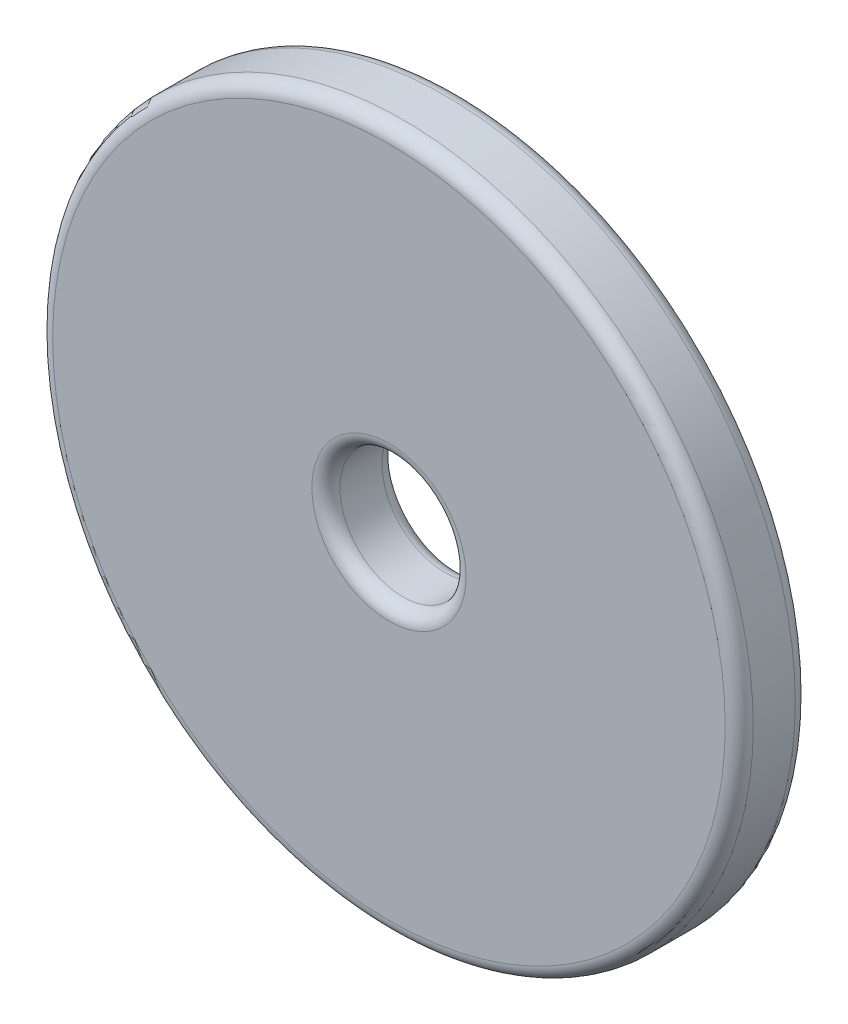
ISO-10303-21;
HEADER;
FILE_DESCRIPTION(('STEP AP214'),'2;1');
FILE_NAME('part.step','',(''),(''),'','','');
FILE_SCHEMA(('AUTOMOTIVE_DESIGN { 1 0 10303 214 1 1 1 1 }'));
ENDSEC;
DATA;
#1=APPLICATION_CONTEXT('core data for automotive mechanical design processes');
#2=APPLICATION_PROTOCOL_DEFINITION('international standard','automotive_design',2000,#1);
#3=PRODUCT_CONTEXT('',#1,'mechanical');
#4=PRODUCT('Part','Part','',(#3));
#5=PRODUCT_RELATED_PRODUCT_CATEGORY('part','',(#4));
#6=PRODUCT_DEFINITION_FORMATION('','',#4);
#7=PRODUCT_DEFINITION_CONTEXT('part definition',#1,'design');
#8=PRODUCT_DEFINITION('design','',#6,#7);
#9=PRODUCT_DEFINITION_SHAPE('','',#8);
#10=(LENGTH_UNIT() NAMED_UNIT(*) SI_UNIT(.MILLI.,.METRE.));
#11=(NAMED_UNIT(*) PLANE_ANGLE_UNIT() SI_UNIT($,.RADIAN.));
#12=(NAMED_UNIT(*) SI_UNIT($,.STERADIAN.) SOLID_ANGLE_UNIT());
#13=UNCERTAINTY_MEASURE_WITH_UNIT(LENGTH_MEASURE(1.E-05),#10,'distance_accuracy_value','');
#14=(GEOMETRIC_REPRESENTATION_CONTEXT(3) GLOBAL_UNCERTAINTY_ASSIGNED_CONTEXT((#13)) GLOBAL_UNIT_ASSIGNED_CONTEXT((#10,
#11,#12)) REPRESENTATION_CONTEXT('',''));
#15=CARTESIAN_POINT('',(0.,0.,0.));
#16=DIRECTION('',(0.,0.,1.));
#17=DIRECTION('',(1.,0.,0.));
#18=AXIS2_PLACEMENT_3D('',#15,#16,#17);
#19=CARTESIAN_POINT('',(0.,0.,0.));
#20=DIRECTION('',(0.,0.,1.));
#21=DIRECTION('',(1.,0.,0.));
#22=AXIS2_PLACEMENT_3D('',#19,#20,#21);
#23=PLANE('',#22);
#24=CARTESIAN_POINT('',(0.,0.,0.));
#25=DIRECTION('',(0.,0.,1.));
#26=DIRECTION('',(1.,0.,0.));
#27=AXIS2_PLACEMENT_3D('',#24,#25,#26);
#28=CIRCLE('',#27,2.75);
#29=CARTESIAN_POINT('',(2.75,0.,0.));
#30=VERTEX_POINT('',#29);
#31=EDGE_CURVE('E10',#30,#30,#28,.T.);
#32=ORIENTED_EDGE('',*,*,#31,.T.);
#33=EDGE_LOOP('',(#32));
#34=FACE_BOUND('',#33,.T.);
#35=CARTESIAN_POINT('',(0.,0.,0.));
#36=DIRECTION('',(0.,0.,1.));
#37=DIRECTION('',(1.,0.,0.));
#38=AXIS2_PLACEMENT_3D('',#35,#36,#37);
#39=CIRCLE('',#38,12.);
#40=CARTESIAN_POINT('',(12.,0.,0.));
#41=VERTEX_POINT('',#40);
#42=EDGE_CURVE('E40',#41,#41,#39,.F.);
#43=ORIENTED_EDGE('',*,*,#42,.T.);
#44=EDGE_LOOP('',(#43));
#45=FACE_BOUND('',#44,.T.);
#46=ADVANCED_FACE('F33',(#34,#45),#23,.F.);
#47=CARTESIAN_POINT('',(0.,0.,2.5));
#48=DIRECTION('',(0.,0.,1.));
#49=DIRECTION('',(1.,0.,0.));
#50=AXIS2_PLACEMENT_3D('',#47,#48,#49);
#51=PLANE('',#50);
#52=CARTESIAN_POINT('',(0.,0.,2.5));
#53=DIRECTION('',(0.,0.,1.));
#54=DIRECTION('',(1.,0.,0.));
#55=AXIS2_PLACEMENT_3D('',#52,#53,#54);
#56=CIRCLE('',#55,12.);
#57=CARTESIAN_POINT('',(12.,0.,2.5));
#58=VERTEX_POINT('',#57);
#59=EDGE_CURVE('E59',#58,#58,#56,.T.);
#60=ORIENTED_EDGE('',*,*,#59,.T.);
#61=EDGE_LOOP('',(#60));
#62=FACE_BOUND('',#61,.T.);
#63=CARTESIAN_POINT('',(0.,0.,2.5));
#64=DIRECTION('',(0.,0.,1.));
#65=DIRECTION('',(1.,0.,0.));
#66=AXIS2_PLACEMENT_3D('',#63,#64,#65);
#67=CIRCLE('',#66,2.75);
#68=CARTESIAN_POINT('',(2.75,0.,2.5));
#69=VERTEX_POINT('',#68);
#70=EDGE_CURVE('E62',#69,#69,#67,.F.);
#71=ORIENTED_EDGE('',*,*,#70,.T.);
#72=EDGE_LOOP('',(#71));
#73=FACE_BOUND('',#72,.T.);
#74=ADVANCED_FACE('F66',(#62,#73),#51,.T.);
#75=CARTESIAN_POINT('',(0.,0.,2.5));
#76=DIRECTION('',(0.,0.,-1.));
#77=DIRECTION('',(-1.,0.,0.));
#78=AXIS2_PLACEMENT_3D('',#75,#76,#77);
#79=CYLINDRICAL_SURFACE('',#78,2.25);
#80=CARTESIAN_POINT('',(0.,0.,2.));
#81=DIRECTION('',(0.,0.,1.));
#82=DIRECTION('',(1.,0.,0.));
#83=AXIS2_PLACEMENT_3D('',#80,#81,#82);
#84=CIRCLE('',#83,2.25);
#85=CARTESIAN_POINT('',(2.25,0.,2.));
#86=VERTEX_POINT('',#85);
#87=EDGE_CURVE('E44',#86,#86,#84,.T.);
#88=ORIENTED_EDGE('',*,*,#87,.T.);
#89=EDGE_LOOP('',(#88));
#90=FACE_BOUND('',#89,.T.);
#91=CARTESIAN_POINT('',(0.,0.,0.5));
#92=DIRECTION('',(0.,0.,1.));
#93=DIRECTION('',(1.,0.,0.));
#94=AXIS2_PLACEMENT_3D('',#91,#92,#93);
#95=CIRCLE('',#94,2.25);
#96=CARTESIAN_POINT('',(2.25,0.,0.5));
#97=VERTEX_POINT('',#96);
#98=EDGE_CURVE('E48',#97,#97,#95,.F.);
#99=ORIENTED_EDGE('',*,*,#98,.T.);
#100=EDGE_LOOP('',(#99));
#101=FACE_BOUND('',#100,.T.);
#102=ADVANCED_FACE('F76',(#90,#101),#79,.F.);
#103=CARTESIAN_POINT('',(0.,0.,-1.));
#104=DIRECTION('',(0.,0.,1.));
#105=DIRECTION('',(1.,0.,0.));
#106=AXIS2_PLACEMENT_3D('',#103,#104,#105);
#107=CYLINDRICAL_SURFACE('',#106,12.5);
#108=CARTESIAN_POINT('',(0.,0.,2.));
#109=DIRECTION('',(0.,0.,1.));
#110=DIRECTION('',(1.,0.,0.));
#111=AXIS2_PLACEMENT_3D('',#108,#109,#110);
#112=CIRCLE('',#111,12.5);
#113=CARTESIAN_POINT('',(12.5,0.,2.));
#114=VERTEX_POINT('',#113);
#115=EDGE_CURVE('E53',#114,#114,#112,.F.);
#116=ORIENTED_EDGE('',*,*,#115,.T.);
#117=EDGE_LOOP('',(#116));
#118=FACE_BOUND('',#117,.T.);
#119=CARTESIAN_POINT('',(0.,0.,0.5));
#120=DIRECTION('',(0.,0.,1.));
#121=DIRECTION('',(1.,0.,0.));
#122=AXIS2_PLACEMENT_3D('',#119,#120,#121);
#123=CIRCLE('',#122,12.5);
#124=CARTESIAN_POINT('',(12.5,0.,0.5));
#125=VERTEX_POINT('',#124);
#126=EDGE_CURVE('E56',#125,#125,#123,.T.);
#127=ORIENTED_EDGE('',*,*,#126,.T.);
#128=EDGE_LOOP('',(#127));
#129=FACE_BOUND('',#128,.T.);
#130=ADVANCED_FACE('F79',(#118,#129),#107,.T.);
#131=CARTESIAN_POINT('',(0.,0.,2.));
#132=DIRECTION('',(0.,0.,1.));
#133=DIRECTION('',(1.,0.,0.));
#134=AXIS2_PLACEMENT_3D('',#131,#132,#133);
#135=TOROIDAL_SURFACE('',#134,12.,0.5);
#136=ORIENTED_EDGE('',*,*,#115,.F.);
#137=EDGE_LOOP('',(#136));
#138=FACE_BOUND('',#137,.T.);
#139=ORIENTED_EDGE('',*,*,#59,.F.);
#140=EDGE_LOOP('',(#139));
#141=FACE_BOUND('',#140,.T.);
#142=ADVANCED_FACE('F72',(#138,#141),#135,.T.);
#143=CARTESIAN_POINT('',(0.,0.,2.));
#144=DIRECTION('',(0.,0.,1.));
#145=DIRECTION('',(1.,0.,0.));
#146=AXIS2_PLACEMENT_3D('',#143,#144,#145);
#147=TOROIDAL_SURFACE('',#146,2.75,0.5);
#148=ORIENTED_EDGE('',*,*,#70,.F.);
#149=EDGE_LOOP('',(#148));
#150=FACE_BOUND('',#149,.T.);
#151=ORIENTED_EDGE('',*,*,#87,.F.);
#152=EDGE_LOOP('',(#151));
#153=FACE_BOUND('',#152,.T.);
#154=ADVANCED_FACE('F68',(#150,#153),#147,.T.);
#155=CARTESIAN_POINT('',(0.,0.,0.5));
#156=DIRECTION('',(0.,0.,1.));
#157=DIRECTION('',(1.,0.,0.));
#158=AXIS2_PLACEMENT_3D('',#155,#156,#157);
#159=TOROIDAL_SURFACE('',#158,2.75,0.5);
#160=ORIENTED_EDGE('',*,*,#98,.F.);
#161=EDGE_LOOP('',(#160));
#162=FACE_BOUND('',#161,.T.);
#163=ORIENTED_EDGE('',*,*,#31,.F.);
#164=EDGE_LOOP('',(#163));
#165=FACE_BOUND('',#164,.T.);
#166=ADVANCED_FACE('F71',(#162,#165),#159,.T.);
#167=CARTESIAN_POINT('',(0.,0.,0.5));
#168=DIRECTION('',(0.,0.,1.));
#169=DIRECTION('',(1.,0.,0.));
#170=AXIS2_PLACEMENT_3D('',#167,#168,#169);
#171=TOROIDAL_SURFACE('',#170,12.,0.5);
#172=ORIENTED_EDGE('',*,*,#42,.F.);
#173=EDGE_LOOP('',(#172));
#174=FACE_BOUND('',#173,.T.);
#175=ORIENTED_EDGE('',*,*,#126,.F.);
#176=EDGE_LOOP('',(#175));
#177=FACE_BOUND('',#176,.T.);
#178=ADVANCED_FACE('F35',(#174,#177),#171,.T.);
#179=CLOSED_SHELL('',(#46,#74,#102,#130,#142,#154,#166,#178));
#180=MANIFOLD_SOLID_BREP('B2',#179);
#181=ADVANCED_BREP_SHAPE_REPRESENTATION('',(#18,#180),#14);
#182=SHAPE_DEFINITION_REPRESENTATION(#9,#181);
ENDSEC;
END-ISO-10303-21;
